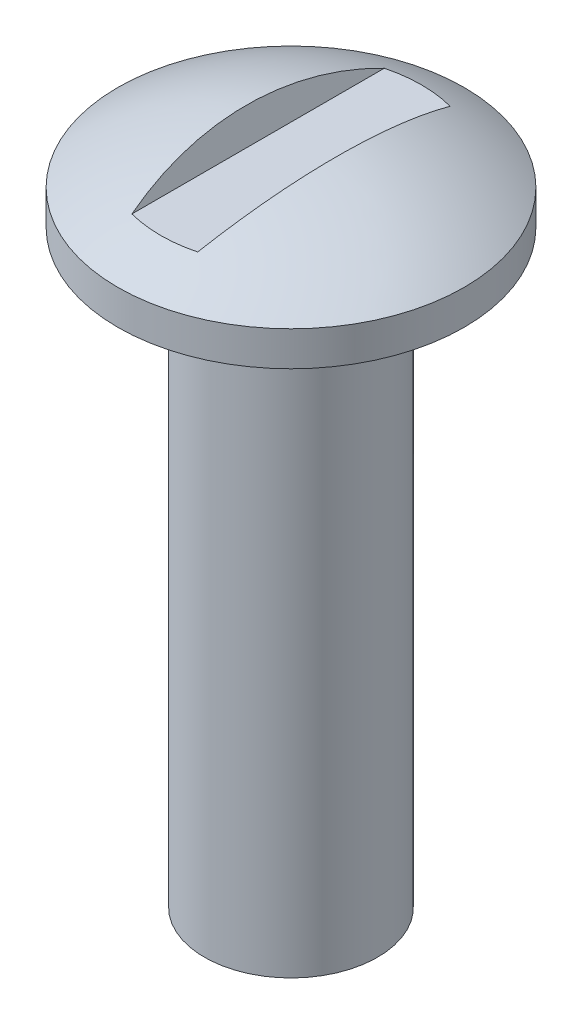
ISO-10303-21;
HEADER;
FILE_DESCRIPTION(('STEP AP214'),'2;1');
FILE_NAME('part.step','',(''),(''),'','','');
FILE_SCHEMA(('AUTOMOTIVE_DESIGN { 1 0 10303 214 1 1 1 1 }'));
ENDSEC;
DATA;
#1=APPLICATION_CONTEXT('core data for automotive mechanical design processes');
#2=APPLICATION_PROTOCOL_DEFINITION('international standard','automotive_design',2000,#1);
#3=PRODUCT_CONTEXT('',#1,'mechanical');
#4=PRODUCT('Part','Part','',(#3));
#5=PRODUCT_RELATED_PRODUCT_CATEGORY('part','',(#4));
#6=PRODUCT_DEFINITION_FORMATION('','',#4);
#7=PRODUCT_DEFINITION_CONTEXT('part definition',#1,'design');
#8=PRODUCT_DEFINITION('design','',#6,#7);
#9=PRODUCT_DEFINITION_SHAPE('','',#8);
#10=(LENGTH_UNIT() NAMED_UNIT(*) SI_UNIT(.MILLI.,.METRE.));
#11=(NAMED_UNIT(*) PLANE_ANGLE_UNIT() SI_UNIT($,.RADIAN.));
#12=(NAMED_UNIT(*) SI_UNIT($,.STERADIAN.) SOLID_ANGLE_UNIT());
#13=UNCERTAINTY_MEASURE_WITH_UNIT(LENGTH_MEASURE(1.E-05),#10,'distance_accuracy_value','');
#14=(GEOMETRIC_REPRESENTATION_CONTEXT(3) GLOBAL_UNCERTAINTY_ASSIGNED_CONTEXT((#13)) GLOBAL_UNIT_ASSIGNED_CONTEXT((#10,
#11,#12)) REPRESENTATION_CONTEXT('',''));
#15=CARTESIAN_POINT('',(0.,0.,0.));
#16=DIRECTION('',(0.,0.,1.));
#17=DIRECTION('',(1.,0.,0.));
#18=AXIS2_PLACEMENT_3D('',#15,#16,#17);
#19=CARTESIAN_POINT('',(0.,26.4583333333333,0.));
#20=DIRECTION('',(0.,0.,1.));
#21=DIRECTION('',(1.,0.,0.));
#22=AXIS2_PLACEMENT_3D('',#19,#20,#21);
#23=SPHERICAL_SURFACE('',#22,23.0716666666667);
#24=CARTESIAN_POINT('',(-6.17652364140873,29.3963553897872,0.));
#25=DIRECTION('',(0.903040894087308,-0.429554587457747,0.));
#26=DIRECTION('',(0.429554587457747,0.903040894087308,0.));
#27=AXIS2_PLACEMENT_3D('',#24,#25,#26);
#28=CIRCLE('',#27,22.0345271081702);
#29=CARTESIAN_POINT('',(2.41305032681528,47.4539824820763,-9.25536102596334));
#30=VERTEX_POINT('',#29);
#31=CARTESIAN_POINT('',(2.41305032681528,47.4539824820763,9.25536102596334));
#32=VERTEX_POINT('',#31);
#33=EDGE_CURVE('E71',#30,#32,#28,.T.);
#34=ORIENTED_EDGE('',*,*,#33,.T.);
#35=CARTESIAN_POINT('',(1.20748896339069E-13,47.4539824820764,0.));
#36=DIRECTION('',(0.,-1.,0.));
#37=DIRECTION('',(1.,0.,0.));
#38=AXIS2_PLACEMENT_3D('',#35,#36,#37);
#39=CIRCLE('',#38,9.56475402719087);
#40=CARTESIAN_POINT('',(-2.41305032681528,47.4539824820764,9.25536102596328));
#41=VERTEX_POINT('',#40);
#42=EDGE_CURVE('E11',#32,#41,#39,.T.);
#43=ORIENTED_EDGE('',*,*,#42,.T.);
#44=CARTESIAN_POINT('',(6.17652364140875,29.3963553897872,0.));
#45=DIRECTION('',(-0.903040894087308,-0.429554587457747,0.));
#46=DIRECTION('',(0.429554587457747,-0.903040894087308,0.));
#47=AXIS2_PLACEMENT_3D('',#44,#45,#46);
#48=CIRCLE('',#47,22.0345271081702);
#49=CARTESIAN_POINT('',(-2.41305032681528,47.4539824820764,-9.25536102596328));
#50=VERTEX_POINT('',#49);
#51=EDGE_CURVE('E41',#41,#50,#48,.T.);
#52=ORIENTED_EDGE('',*,*,#51,.T.);
#53=EDGE_CURVE('E47',#50,#30,#39,.T.);
#54=ORIENTED_EDGE('',*,*,#53,.T.);
#55=EDGE_LOOP('',(#34,#43,#52,#54));
#56=FACE_BOUND('',#55,.T.);
#57=CARTESIAN_POINT('',(0.,45.72,0.));
#58=DIRECTION('',(0.,-1.,0.));
#59=DIRECTION('',(0.,0.,-1.));
#60=AXIS2_PLACEMENT_3D('',#57,#58,#59);
#61=CIRCLE('',#60,12.7);
#62=CARTESIAN_POINT('',(0.,45.72,-12.7));
#63=VERTEX_POINT('',#62);
#64=EDGE_CURVE('E76',#63,#63,#61,.T.);
#65=ORIENTED_EDGE('',*,*,#64,.F.);
#66=EDGE_LOOP('',(#65));
#67=FACE_BOUND('',#66,.T.);
#68=ADVANCED_FACE('F38',(#56,#67),#23,.T.);
#69=CARTESIAN_POINT('',(0.,0.,0.));
#70=DIRECTION('',(0.,-1.,0.));
#71=DIRECTION('',(0.,0.,-1.));
#72=AXIS2_PLACEMENT_3D('',#69,#70,#71);
#73=CYLINDRICAL_SURFACE('',#72,12.7);
#74=CARTESIAN_POINT('',(0.,43.18,0.));
#75=DIRECTION('',(0.,-1.,0.));
#76=DIRECTION('',(0.,0.,-1.));
#77=AXIS2_PLACEMENT_3D('',#74,#75,#76);
#78=CIRCLE('',#77,12.7);
#79=CARTESIAN_POINT('',(0.,43.18,-12.7));
#80=VERTEX_POINT('',#79);
#81=EDGE_CURVE('E80',#80,#80,#78,.T.);
#82=ORIENTED_EDGE('',*,*,#81,.F.);
#83=EDGE_LOOP('',(#82));
#84=FACE_BOUND('',#83,.T.);
#85=ORIENTED_EDGE('',*,*,#64,.T.);
#86=EDGE_LOOP('',(#85));
#87=FACE_BOUND('',#86,.T.);
#88=ADVANCED_FACE('F101',(#84,#87),#73,.T.);
#89=CARTESIAN_POINT('',(-12.7,43.18,0.));
#90=DIRECTION('',(0.,1.,0.));
#91=DIRECTION('',(0.,0.,1.));
#92=AXIS2_PLACEMENT_3D('',#89,#90,#91);
#93=PLANE('',#92);
#94=CARTESIAN_POINT('',(0.,43.18,0.));
#95=DIRECTION('',(0.,-1.,0.));
#96=DIRECTION('',(0.,0.,-1.));
#97=AXIS2_PLACEMENT_3D('',#94,#95,#96);
#98=CIRCLE('',#97,6.35);
#99=CARTESIAN_POINT('',(0.,43.18,-6.35));
#100=VERTEX_POINT('',#99);
#101=EDGE_CURVE('E83',#100,#100,#98,.T.);
#102=ORIENTED_EDGE('',*,*,#101,.F.);
#103=EDGE_LOOP('',(#102));
#104=FACE_BOUND('',#103,.T.);
#105=ORIENTED_EDGE('',*,*,#81,.T.);
#106=EDGE_LOOP('',(#105));
#107=FACE_BOUND('',#106,.T.);
#108=ADVANCED_FACE('F95',(#104,#107),#93,.F.);
#109=CARTESIAN_POINT('',(0.,0.,0.));
#110=DIRECTION('',(0.,-1.,0.));
#111=DIRECTION('',(0.,0.,-1.));
#112=AXIS2_PLACEMENT_3D('',#109,#110,#111);
#113=CYLINDRICAL_SURFACE('',#112,6.35);
#114=CARTESIAN_POINT('',(0.,0.,0.));
#115=DIRECTION('',(0.,-1.,0.));
#116=DIRECTION('',(0.,0.,-1.));
#117=AXIS2_PLACEMENT_3D('',#114,#115,#116);
#118=CIRCLE('',#117,6.34999999999999);
#119=CARTESIAN_POINT('',(0.,0.,-6.34999999999999));
#120=VERTEX_POINT('',#119);
#121=EDGE_CURVE('E73',#120,#120,#118,.T.);
#122=ORIENTED_EDGE('',*,*,#121,.F.);
#123=EDGE_LOOP('',(#122));
#124=FACE_BOUND('',#123,.T.);
#125=ORIENTED_EDGE('',*,*,#101,.T.);
#126=EDGE_LOOP('',(#125));
#127=FACE_BOUND('',#126,.T.);
#128=ADVANCED_FACE('F92',(#124,#127),#113,.T.);
#129=CARTESIAN_POINT('',(-6.34999999999999,0.,0.));
#130=DIRECTION('',(0.,1.,0.));
#131=DIRECTION('',(0.,0.,1.));
#132=AXIS2_PLACEMENT_3D('',#129,#130,#131);
#133=PLANE('',#132);
#134=ORIENTED_EDGE('',*,*,#121,.T.);
#135=EDGE_LOOP('',(#134));
#136=FACE_BOUND('',#135,.T.);
#137=ADVANCED_FACE('F90',(#136),#133,.F.);
#138=CARTESIAN_POINT('',(-7.09988745970984,57.3069923637297,-12.7));
#139=DIRECTION('',(-0.903040894087308,-0.429554587457747,0.));
#140=DIRECTION('',(0.429554587457747,-0.903040894087308,0.));
#141=AXIS2_PLACEMENT_3D('',#138,#139,#140);
#142=PLANE('',#141);
#143=DIRECTION('',(0.,0.,1.));
#144=VECTOR('',#143,1.);
#145=CARTESIAN_POINT('',(-2.41305032681528,47.4539824820764,-12.7));
#146=LINE('',#145,#144);
#147=EDGE_CURVE('E66',#50,#41,#146,.T.);
#148=ORIENTED_EDGE('',*,*,#147,.F.);
#149=ORIENTED_EDGE('',*,*,#51,.F.);
#150=EDGE_LOOP('',(#148,#149));
#151=FACE_BOUND('',#150,.T.);
#152=ADVANCED_FACE('F130',(#151),#142,.F.);
#153=CARTESIAN_POINT('',(7.09988745970984,57.3069923637297,-12.7));
#154=DIRECTION('',(0.903040894087308,-0.429554587457747,0.));
#155=DIRECTION('',(0.429554587457747,0.903040894087308,0.));
#156=AXIS2_PLACEMENT_3D('',#153,#154,#155);
#157=PLANE('',#156);
#158=DIRECTION('',(0.,0.,1.));
#159=VECTOR('',#158,1.);
#160=CARTESIAN_POINT('',(2.41305032681528,47.4539824820763,-12.7));
#161=LINE('',#160,#159);
#162=EDGE_CURVE('E54',#30,#32,#161,.T.);
#163=ORIENTED_EDGE('',*,*,#162,.T.);
#164=ORIENTED_EDGE('',*,*,#33,.F.);
#165=EDGE_LOOP('',(#163,#164));
#166=FACE_BOUND('',#165,.T.);
#167=ADVANCED_FACE('F70',(#166),#157,.F.);
#168=CARTESIAN_POINT('',(-2.41305032681528,47.4539824820764,-12.7));
#169=DIRECTION('',(0.,-1.,0.));
#170=DIRECTION('',(1.,0.,0.));
#171=AXIS2_PLACEMENT_3D('',#168,#169,#170);
#172=PLANE('',#171);
#173=ORIENTED_EDGE('',*,*,#162,.F.);
#174=ORIENTED_EDGE('',*,*,#53,.F.);
#175=ORIENTED_EDGE('',*,*,#147,.T.);
#176=ORIENTED_EDGE('',*,*,#42,.F.);
#177=EDGE_LOOP('',(#173,#174,#175,#176));
#178=FACE_BOUND('',#177,.T.);
#179=ADVANCED_FACE('F65',(#178),#172,.F.);
#180=CLOSED_SHELL('',(#68,#88,#108,#128,#137,#152,#167,#179));
#181=MANIFOLD_SOLID_BREP('B2',#180);
#182=ADVANCED_BREP_SHAPE_REPRESENTATION('',(#18,#181),#14);
#183=SHAPE_DEFINITION_REPRESENTATION(#9,#182);
ENDSEC;
END-ISO-10303-21;
